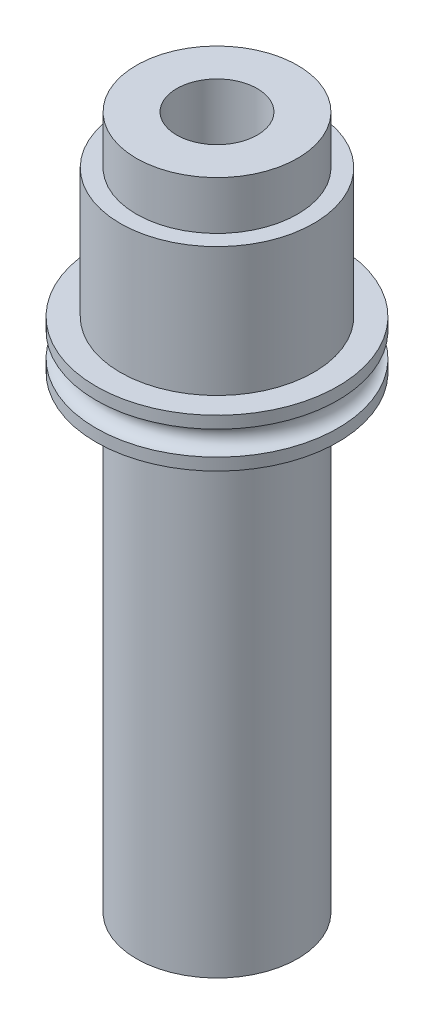
ISO-10303-21;
HEADER;
FILE_DESCRIPTION(('STEP AP214'),'2;1');
FILE_NAME('part.step','',(''),(''),'','','');
FILE_SCHEMA(('AUTOMOTIVE_DESIGN { 1 0 10303 214 1 1 1 1 }'));
ENDSEC;
DATA;
#1=APPLICATION_CONTEXT('core data for automotive mechanical design processes');
#2=APPLICATION_PROTOCOL_DEFINITION('international standard','automotive_design',2000,#1);
#3=PRODUCT_CONTEXT('',#1,'mechanical');
#4=PRODUCT('Part','Part','',(#3));
#5=PRODUCT_RELATED_PRODUCT_CATEGORY('part','',(#4));
#6=PRODUCT_DEFINITION_FORMATION('','',#4);
#7=PRODUCT_DEFINITION_CONTEXT('part definition',#1,'design');
#8=PRODUCT_DEFINITION('design','',#6,#7);
#9=PRODUCT_DEFINITION_SHAPE('','',#8);
#10=(LENGTH_UNIT() NAMED_UNIT(*) SI_UNIT(.MILLI.,.METRE.));
#11=(NAMED_UNIT(*) PLANE_ANGLE_UNIT() SI_UNIT($,.RADIAN.));
#12=(NAMED_UNIT(*) SI_UNIT($,.STERADIAN.) SOLID_ANGLE_UNIT());
#13=UNCERTAINTY_MEASURE_WITH_UNIT(LENGTH_MEASURE(1.E-05),#10,'distance_accuracy_value','');
#14=(GEOMETRIC_REPRESENTATION_CONTEXT(3) GLOBAL_UNCERTAINTY_ASSIGNED_CONTEXT((#13)) GLOBAL_UNIT_ASSIGNED_CONTEXT((#10,
#11,#12)) REPRESENTATION_CONTEXT('',''));
#15=CARTESIAN_POINT('',(0.,0.,0.));
#16=DIRECTION('',(0.,0.,1.));
#17=DIRECTION('',(1.,0.,0.));
#18=AXIS2_PLACEMENT_3D('',#15,#16,#17);
#19=CARTESIAN_POINT('',(0.,-29.,0.));
#20=DIRECTION('',(0.,-1.,0.));
#21=DIRECTION('',(0.,0.,-1.));
#22=AXIS2_PLACEMENT_3D('',#19,#20,#21);
#23=PLANE('',#22);
#24=CARTESIAN_POINT('',(0.,-29.,0.));
#25=DIRECTION('',(0.,-1.,0.));
#26=DIRECTION('',(0.,0.,-1.));
#27=AXIS2_PLACEMENT_3D('',#24,#25,#26);
#28=CIRCLE('',#27,5.);
#29=CARTESIAN_POINT('',(0.,-29.,5.));
#30=VERTEX_POINT('',#29);
#31=EDGE_CURVE('E52',#30,#30,#28,.T.);
#32=ORIENTED_EDGE('',*,*,#31,.T.);
#33=EDGE_LOOP('',(#32));
#34=FACE_BOUND('',#33,.T.);
#35=CARTESIAN_POINT('',(0.,-29.,0.));
#36=DIRECTION('',(0.,1.,0.));
#37=DIRECTION('',(0.,0.,1.));
#38=AXIS2_PLACEMENT_3D('',#35,#36,#37);
#39=CIRCLE('',#38,2.5);
#40=CARTESIAN_POINT('',(0.,-29.,2.5));
#41=VERTEX_POINT('',#40);
#42=EDGE_CURVE('E117',#41,#41,#39,.T.);
#43=ORIENTED_EDGE('',*,*,#42,.T.);
#44=EDGE_LOOP('',(#43));
#45=FACE_BOUND('',#44,.T.);
#46=ADVANCED_FACE('F33',(#34,#45),#23,.T.);
#47=CARTESIAN_POINT('',(0.,14.,0.));
#48=DIRECTION('',(0.,1.,0.));
#49=DIRECTION('',(0.,0.,1.));
#50=AXIS2_PLACEMENT_3D('',#47,#48,#49);
#51=PLANE('',#50);
#52=CARTESIAN_POINT('',(0.,14.,0.));
#53=DIRECTION('',(0.,1.,0.));
#54=DIRECTION('',(0.,0.,1.));
#55=AXIS2_PLACEMENT_3D('',#52,#53,#54);
#56=CIRCLE('',#55,5.);
#57=CARTESIAN_POINT('',(0.,14.,5.));
#58=VERTEX_POINT('',#57);
#59=EDGE_CURVE('E107',#58,#58,#56,.T.);
#60=ORIENTED_EDGE('',*,*,#59,.T.);
#61=EDGE_LOOP('',(#60));
#62=FACE_BOUND('',#61,.T.);
#63=CARTESIAN_POINT('',(0.,14.,0.));
#64=DIRECTION('',(0.,1.,0.));
#65=DIRECTION('',(0.,0.,1.));
#66=AXIS2_PLACEMENT_3D('',#63,#64,#65);
#67=CIRCLE('',#66,2.5);
#68=CARTESIAN_POINT('',(0.,14.,2.5));
#69=VERTEX_POINT('',#68);
#70=EDGE_CURVE('E115',#69,#69,#67,.T.);
#71=ORIENTED_EDGE('',*,*,#70,.F.);
#72=EDGE_LOOP('',(#71));
#73=FACE_BOUND('',#72,.T.);
#74=ADVANCED_FACE('F78',(#62,#73),#51,.T.);
#75=CARTESIAN_POINT('',(0.,11.,0.));
#76=DIRECTION('',(0.,1.,0.));
#77=DIRECTION('',(0.,0.,1.));
#78=AXIS2_PLACEMENT_3D('',#75,#76,#77);
#79=PLANE('',#78);
#80=CARTESIAN_POINT('',(0.,11.,0.));
#81=DIRECTION('',(0.,1.,0.));
#82=DIRECTION('',(0.,0.,1.));
#83=AXIS2_PLACEMENT_3D('',#80,#81,#82);
#84=CIRCLE('',#83,6.);
#85=CARTESIAN_POINT('',(0.,11.,6.));
#86=VERTEX_POINT('',#85);
#87=EDGE_CURVE('E106',#86,#86,#84,.T.);
#88=ORIENTED_EDGE('',*,*,#87,.T.);
#89=EDGE_LOOP('',(#88));
#90=FACE_BOUND('',#89,.T.);
#91=CARTESIAN_POINT('',(0.,11.,0.));
#92=DIRECTION('',(0.,1.,0.));
#93=DIRECTION('',(0.,0.,1.));
#94=AXIS2_PLACEMENT_3D('',#91,#92,#93);
#95=CIRCLE('',#94,5.);
#96=CARTESIAN_POINT('',(0.,11.,5.));
#97=VERTEX_POINT('',#96);
#98=EDGE_CURVE('E111',#97,#97,#95,.T.);
#99=ORIENTED_EDGE('',*,*,#98,.F.);
#100=EDGE_LOOP('',(#99));
#101=FACE_BOUND('',#100,.T.);
#102=ADVANCED_FACE('F84',(#90,#101),#79,.T.);
#103=CARTESIAN_POINT('',(0.,3.,0.));
#104=DIRECTION('',(0.,1.,0.));
#105=DIRECTION('',(0.,0.,1.));
#106=AXIS2_PLACEMENT_3D('',#103,#104,#105);
#107=PLANE('',#106);
#108=CARTESIAN_POINT('',(0.,3.,0.));
#109=DIRECTION('',(0.,1.,0.));
#110=DIRECTION('',(0.,0.,1.));
#111=AXIS2_PLACEMENT_3D('',#108,#109,#110);
#112=CIRCLE('',#111,7.5);
#113=CARTESIAN_POINT('',(0.,3.,7.5));
#114=VERTEX_POINT('',#113);
#115=EDGE_CURVE('E40',#114,#114,#112,.T.);
#116=ORIENTED_EDGE('',*,*,#115,.T.);
#117=EDGE_LOOP('',(#116));
#118=FACE_BOUND('',#117,.T.);
#119=CARTESIAN_POINT('',(0.,3.,0.));
#120=DIRECTION('',(0.,1.,0.));
#121=DIRECTION('',(0.,0.,1.));
#122=AXIS2_PLACEMENT_3D('',#119,#120,#121);
#123=CIRCLE('',#122,6.);
#124=CARTESIAN_POINT('',(0.,3.,6.));
#125=VERTEX_POINT('',#124);
#126=EDGE_CURVE('E104',#125,#125,#123,.T.);
#127=ORIENTED_EDGE('',*,*,#126,.F.);
#128=EDGE_LOOP('',(#127));
#129=FACE_BOUND('',#128,.T.);
#130=ADVANCED_FACE('F72',(#118,#129),#107,.T.);
#131=CARTESIAN_POINT('',(0.,0.,0.));
#132=DIRECTION('',(0.,1.,0.));
#133=DIRECTION('',(0.,0.,1.));
#134=AXIS2_PLACEMENT_3D('',#131,#132,#133);
#135=PLANE('',#134);
#136=CARTESIAN_POINT('',(0.,0.,0.));
#137=DIRECTION('',(0.,1.,0.));
#138=DIRECTION('',(0.,0.,1.));
#139=AXIS2_PLACEMENT_3D('',#136,#137,#138);
#140=CIRCLE('',#139,7.5);
#141=CARTESIAN_POINT('',(0.,0.,7.5));
#142=VERTEX_POINT('',#141);
#143=EDGE_CURVE('E44',#142,#142,#140,.T.);
#144=ORIENTED_EDGE('',*,*,#143,.F.);
#145=EDGE_LOOP('',(#144));
#146=FACE_BOUND('',#145,.T.);
#147=CARTESIAN_POINT('',(0.,0.,0.));
#148=DIRECTION('',(0.,1.,0.));
#149=DIRECTION('',(0.,0.,1.));
#150=AXIS2_PLACEMENT_3D('',#147,#148,#149);
#151=CIRCLE('',#150,5.);
#152=CARTESIAN_POINT('',(0.,0.,5.));
#153=VERTEX_POINT('',#152);
#154=EDGE_CURVE('E10',#153,#153,#151,.F.);
#155=ORIENTED_EDGE('',*,*,#154,.F.);
#156=EDGE_LOOP('',(#155));
#157=FACE_BOUND('',#156,.T.);
#158=ADVANCED_FACE('F63',(#146,#157),#135,.F.);
#159=CARTESIAN_POINT('',(0.,3.,0.));
#160=DIRECTION('',(0.,-1.,0.));
#161=DIRECTION('',(0.,0.,-1.));
#162=AXIS2_PLACEMENT_3D('',#159,#160,#161);
#163=CYLINDRICAL_SURFACE('',#162,7.5);
#164=ORIENTED_EDGE('',*,*,#115,.F.);
#165=EDGE_LOOP('',(#164));
#166=FACE_BOUND('',#165,.T.);
#167=CARTESIAN_POINT('',(0.,2.25,0.));
#168=DIRECTION('',(0.,-1.,0.));
#169=DIRECTION('',(0.,0.,-1.));
#170=AXIS2_PLACEMENT_3D('',#167,#168,#169);
#171=CIRCLE('',#170,7.5);
#172=CARTESIAN_POINT('',(0.,2.25,-7.5));
#173=VERTEX_POINT('',#172);
#174=EDGE_CURVE('E49',#173,#173,#171,.T.);
#175=ORIENTED_EDGE('',*,*,#174,.F.);
#176=EDGE_LOOP('',(#175));
#177=FACE_BOUND('',#176,.T.);
#178=ADVANCED_FACE('F35',(#166,#177),#163,.T.);
#179=CARTESIAN_POINT('',(0.,1.5,0.));
#180=DIRECTION('',(0.,1.,0.));
#181=DIRECTION('',(0.,0.,1.));
#182=AXIS2_PLACEMENT_3D('',#179,#180,#181);
#183=TOROIDAL_SURFACE('',#182,7.5,0.75);
#184=CARTESIAN_POINT('',(0.,0.749999999999999,0.));
#185=DIRECTION('',(0.,1.,0.));
#186=DIRECTION('',(0.,0.,1.));
#187=AXIS2_PLACEMENT_3D('',#184,#185,#186);
#188=CIRCLE('',#187,7.5);
#189=CARTESIAN_POINT('',(0.,0.749999999999999,7.5));
#190=VERTEX_POINT('',#189);
#191=EDGE_CURVE('E55',#190,#190,#188,.T.);
#192=ORIENTED_EDGE('',*,*,#191,.T.);
#193=EDGE_LOOP('',(#192));
#194=FACE_BOUND('',#193,.T.);
#195=ORIENTED_EDGE('',*,*,#174,.T.);
#196=EDGE_LOOP('',(#195));
#197=FACE_BOUND('',#196,.T.);
#198=ADVANCED_FACE('F60',(#194,#197),#183,.F.);
#199=ORIENTED_EDGE('',*,*,#143,.T.);
#200=EDGE_LOOP('',(#199));
#201=FACE_BOUND('',#200,.T.);
#202=ORIENTED_EDGE('',*,*,#191,.F.);
#203=EDGE_LOOP('',(#202));
#204=FACE_BOUND('',#203,.T.);
#205=ADVANCED_FACE('F65',(#201,#204),#163,.T.);
#206=CARTESIAN_POINT('',(0.,-29.,0.));
#207=DIRECTION('',(0.,1.,0.));
#208=DIRECTION('',(0.,0.,1.));
#209=AXIS2_PLACEMENT_3D('',#206,#207,#208);
#210=CYLINDRICAL_SURFACE('',#209,5.);
#211=CARTESIAN_POINT('',(0.,-29.,5.));
#212=CARTESIAN_POINT('',(0.,-28.6979166666667,5.));
#213=CARTESIAN_POINT('',(0.,-28.3958333333333,5.));
#214=CARTESIAN_POINT('',(0.,-27.7916666666667,5.));
#215=CARTESIAN_POINT('',(0.,-27.4895833333333,5.));
#216=CARTESIAN_POINT('',(0.,-26.8854166666667,5.));
#217=CARTESIAN_POINT('',(0.,-26.5833333333333,5.));
#218=CARTESIAN_POINT('',(0.,-25.9791666666667,5.));
#219=CARTESIAN_POINT('',(0.,-25.6770833333333,5.));
#220=CARTESIAN_POINT('',(0.,-25.0729166666667,5.));
#221=CARTESIAN_POINT('',(0.,-24.7708333333333,5.));
#222=CARTESIAN_POINT('',(0.,-24.1666666666667,5.));
#223=CARTESIAN_POINT('',(0.,-23.8645833333333,5.));
#224=CARTESIAN_POINT('',(0.,-23.2604166666667,5.));
#225=CARTESIAN_POINT('',(0.,-22.9583333333333,5.));
#226=CARTESIAN_POINT('',(0.,-22.3541666666667,5.));
#227=CARTESIAN_POINT('',(0.,-22.0520833333333,5.));
#228=CARTESIAN_POINT('',(0.,-21.4479166666667,5.));
#229=CARTESIAN_POINT('',(0.,-21.1458333333333,5.));
#230=CARTESIAN_POINT('',(0.,-20.5416666666667,5.));
#231=CARTESIAN_POINT('',(0.,-20.2395833333333,5.));
#232=CARTESIAN_POINT('',(0.,-19.6354166666667,5.));
#233=CARTESIAN_POINT('',(0.,-19.3333333333333,5.));
#234=CARTESIAN_POINT('',(0.,-18.7291666666667,5.));
#235=CARTESIAN_POINT('',(0.,-18.4270833333333,5.));
#236=CARTESIAN_POINT('',(0.,-17.8229166666667,5.));
#237=CARTESIAN_POINT('',(0.,-17.5208333333333,5.));
#238=CARTESIAN_POINT('',(0.,-16.9166666666667,5.));
#239=CARTESIAN_POINT('',(0.,-16.6145833333333,5.));
#240=CARTESIAN_POINT('',(0.,-16.0104166666667,5.));
#241=CARTESIAN_POINT('',(0.,-15.7083333333333,5.));
#242=CARTESIAN_POINT('',(0.,-15.1041666666667,5.));
#243=CARTESIAN_POINT('',(0.,-14.8020833333333,5.));
#244=CARTESIAN_POINT('',(0.,-14.1979166666667,5.));
#245=CARTESIAN_POINT('',(0.,-13.8958333333333,5.));
#246=CARTESIAN_POINT('',(0.,-13.2916666666667,5.));
#247=CARTESIAN_POINT('',(0.,-12.9895833333333,5.));
#248=CARTESIAN_POINT('',(0.,-12.3854166666667,5.));
#249=CARTESIAN_POINT('',(0.,-12.0833333333333,5.));
#250=CARTESIAN_POINT('',(0.,-11.4791666666667,5.));
#251=CARTESIAN_POINT('',(0.,-11.1770833333333,5.));
#252=CARTESIAN_POINT('',(0.,-10.5729166666667,5.));
#253=CARTESIAN_POINT('',(0.,-10.2708333333333,5.));
#254=CARTESIAN_POINT('',(0.,-9.66666666666667,5.));
#255=CARTESIAN_POINT('',(0.,-9.36458333333333,5.));
#256=CARTESIAN_POINT('',(0.,-8.76041666666667,5.));
#257=CARTESIAN_POINT('',(0.,-8.45833333333333,5.));
#258=CARTESIAN_POINT('',(0.,-7.85416666666667,5.));
#259=CARTESIAN_POINT('',(0.,-7.55208333333333,5.));
#260=CARTESIAN_POINT('',(0.,-6.94791666666667,5.));
#261=CARTESIAN_POINT('',(0.,-6.64583333333333,5.));
#262=CARTESIAN_POINT('',(0.,-6.04166666666667,5.));
#263=CARTESIAN_POINT('',(0.,-5.73958333333333,5.));
#264=CARTESIAN_POINT('',(0.,-5.13541666666667,5.));
#265=CARTESIAN_POINT('',(0.,-4.83333333333333,5.));
#266=CARTESIAN_POINT('',(0.,-4.22916666666667,5.));
#267=CARTESIAN_POINT('',(0.,-3.92708333333333,5.));
#268=CARTESIAN_POINT('',(0.,-3.32291666666667,5.));
#269=CARTESIAN_POINT('',(0.,-3.02083333333333,5.));
#270=CARTESIAN_POINT('',(0.,-2.41666666666667,5.));
#271=CARTESIAN_POINT('',(0.,-2.11458333333333,5.));
#272=CARTESIAN_POINT('',(0.,-1.51041666666667,5.));
#273=CARTESIAN_POINT('',(0.,-1.20833333333333,5.));
#274=CARTESIAN_POINT('',(0.,-0.604166666666667,5.));
#275=CARTESIAN_POINT('',(0.,-0.302083333333333,5.));
#276=CARTESIAN_POINT('',(0.,0.,5.));
#277=B_SPLINE_CURVE_WITH_KNOTS('',3,(#211,#212,#213,#214,#215,#216,#217,#218,#219,#220,#221,
#222,#223,#224,#225,#226,#227,#228,#229,#230,#231,#232,#233,#234,#235,#236,#237,#238,#239,#240,
#241,#242,#243,#244,#245,#246,#247,#248,#249,#250,#251,#252,#253,#254,#255,#256,#257,#258,#259,
#260,#261,#262,#263,#264,#265,#266,#267,#268,#269,#270,#271,#272,#273,#274,#275,#276),
.UNSPECIFIED.,.F.,.F.,(4,2,2,2,2,2,2,2,2,2,2,2,2,2,2,2,2,2,2,2,2,2,2,2,2,2,2,2,2,2,2,2,4),(0.,
0.906249999999997,1.8125,2.71875,3.625,4.53125,5.4375,6.34375,7.25,8.15625,9.0625,9.96875,
10.875,11.78125,12.6875,13.59375,14.5,15.40625,16.3125,17.21875,18.125,19.03125,19.9375,
20.84375,21.75,22.65625,23.5625,24.46875,25.375,26.28125,27.1875,28.09375,29.),.UNSPECIFIED.);
#278=EDGE_CURVE('BSEAM75',#30,#153,#277,.T.);
#279=ORIENTED_EDGE('',*,*,#31,.F.);
#280=ORIENTED_EDGE('',*,*,#154,.T.);
#281=ORIENTED_EDGE('',*,*,#278,.T.);
#282=ORIENTED_EDGE('',*,*,#278,.F.);
#283=EDGE_LOOP('',(#279,#281,#280,#282));
#284=FACE_BOUND('',#283,.T.);
#285=ADVANCED_FACE('F75',(#284),#210,.T.);
#286=CARTESIAN_POINT('',(0.,11.,0.));
#287=DIRECTION('',(0.,-1.,0.));
#288=DIRECTION('',(0.,0.,-1.));
#289=AXIS2_PLACEMENT_3D('',#286,#287,#288);
#290=CYLINDRICAL_SURFACE('',#289,6.);
#291=ORIENTED_EDGE('',*,*,#87,.F.);
#292=EDGE_LOOP('',(#291));
#293=FACE_BOUND('',#292,.T.);
#294=ORIENTED_EDGE('',*,*,#126,.T.);
#295=EDGE_LOOP('',(#294));
#296=FACE_BOUND('',#295,.T.);
#297=ADVANCED_FACE('F91',(#293,#296),#290,.T.);
#298=CARTESIAN_POINT('',(0.,14.,0.));
#299=DIRECTION('',(0.,-1.,0.));
#300=DIRECTION('',(0.,0.,-1.));
#301=AXIS2_PLACEMENT_3D('',#298,#299,#300);
#302=CYLINDRICAL_SURFACE('',#301,5.);
#303=ORIENTED_EDGE('',*,*,#59,.F.);
#304=EDGE_LOOP('',(#303));
#305=FACE_BOUND('',#304,.T.);
#306=ORIENTED_EDGE('',*,*,#98,.T.);
#307=EDGE_LOOP('',(#306));
#308=FACE_BOUND('',#307,.T.);
#309=ADVANCED_FACE('F127',(#305,#308),#302,.T.);
#310=CARTESIAN_POINT('',(0.,14.,0.));
#311=DIRECTION('',(0.,-1.,0.));
#312=DIRECTION('',(0.,0.,-1.));
#313=AXIS2_PLACEMENT_3D('',#310,#311,#312);
#314=CYLINDRICAL_SURFACE('',#313,2.5);
#315=ORIENTED_EDGE('',*,*,#70,.T.);
#316=EDGE_LOOP('',(#315));
#317=FACE_BOUND('',#316,.T.);
#318=ORIENTED_EDGE('',*,*,#42,.F.);
#319=EDGE_LOOP('',(#318));
#320=FACE_BOUND('',#319,.T.);
#321=ADVANCED_FACE('F123',(#317,#320),#314,.F.);
#322=CLOSED_SHELL('',(#46,#74,#102,#130,#158,#178,#198,#205,#285,#297,#309,#321));
#323=MANIFOLD_SOLID_BREP('B2',#322);
#324=ADVANCED_BREP_SHAPE_REPRESENTATION('',(#18,#323),#14);
#325=SHAPE_DEFINITION_REPRESENTATION(#9,#324);
ENDSEC;
END-ISO-10303-21;
